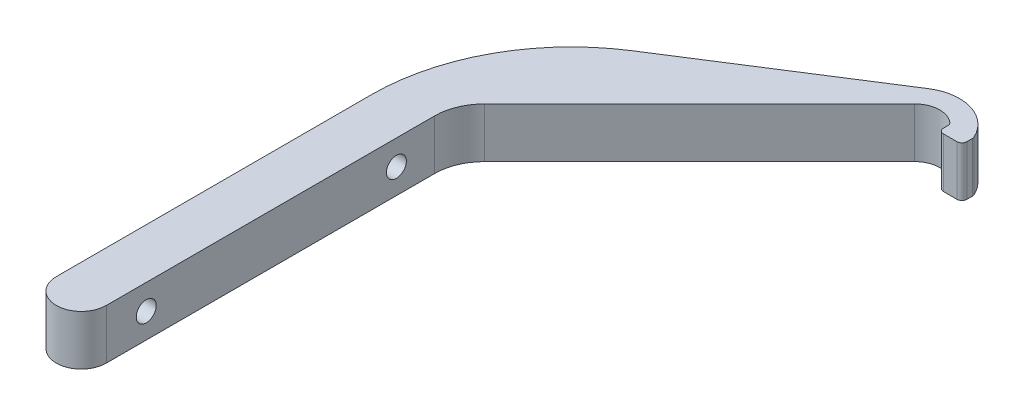
ISO-10303-21;
HEADER;
FILE_DESCRIPTION(('STEP AP214'),'2;1');
FILE_NAME('part.step','',(''),(''),'','','');
FILE_SCHEMA(('AUTOMOTIVE_DESIGN { 1 0 10303 214 1 1 1 1 }'));
ENDSEC;
DATA;
#1=APPLICATION_CONTEXT('core data for automotive mechanical design processes');
#2=APPLICATION_PROTOCOL_DEFINITION('international standard','automotive_design',2000,#1);
#3=PRODUCT_CONTEXT('',#1,'mechanical');
#4=PRODUCT('Part','Part','',(#3));
#5=PRODUCT_RELATED_PRODUCT_CATEGORY('part','',(#4));
#6=PRODUCT_DEFINITION_FORMATION('','',#4);
#7=PRODUCT_DEFINITION_CONTEXT('part definition',#1,'design');
#8=PRODUCT_DEFINITION('design','',#6,#7);
#9=PRODUCT_DEFINITION_SHAPE('','',#8);
#10=(LENGTH_UNIT() NAMED_UNIT(*) SI_UNIT(.MILLI.,.METRE.));
#11=(NAMED_UNIT(*) PLANE_ANGLE_UNIT() SI_UNIT($,.RADIAN.));
#12=(NAMED_UNIT(*) SI_UNIT($,.STERADIAN.) SOLID_ANGLE_UNIT());
#13=UNCERTAINTY_MEASURE_WITH_UNIT(LENGTH_MEASURE(1.E-05),#10,'distance_accuracy_value','');
#14=(GEOMETRIC_REPRESENTATION_CONTEXT(3) GLOBAL_UNCERTAINTY_ASSIGNED_CONTEXT((#13)) GLOBAL_UNIT_ASSIGNED_CONTEXT((#10,
#11,#12)) REPRESENTATION_CONTEXT('',''));
#15=CARTESIAN_POINT('',(0.,0.,0.));
#16=DIRECTION('',(0.,0.,1.));
#17=DIRECTION('',(1.,0.,0.));
#18=AXIS2_PLACEMENT_3D('',#15,#16,#17);
#19=CARTESIAN_POINT('',(5.,10.,10.));
#20=DIRECTION('',(0.,-1.,0.));
#21=DIRECTION('',(0.,0.,-1.));
#22=AXIS2_PLACEMENT_3D('',#19,#20,#21);
#23=CYLINDRICAL_SURFACE('',#22,5.);
#24=CARTESIAN_POINT('',(5.,0.,10.));
#25=DIRECTION('',(0.,1.,0.));
#26=DIRECTION('',(0.,0.,-1.));
#27=AXIS2_PLACEMENT_3D('',#24,#25,#26);
#28=CIRCLE('',#27,5.);
#29=CARTESIAN_POINT('',(0.,0.,10.));
#30=VERTEX_POINT('',#29);
#31=CARTESIAN_POINT('',(10.,0.,9.99999999999996));
#32=VERTEX_POINT('',#31);
#33=EDGE_CURVE('E184',#30,#32,#28,.T.);
#34=ORIENTED_EDGE('',*,*,#33,.T.);
#35=DIRECTION('',(0.,-1.,0.));
#36=VECTOR('',#35,1.);
#37=CARTESIAN_POINT('',(10.,10.,9.99999999999996));
#38=LINE('',#37,#36);
#39=CARTESIAN_POINT('',(10.,10.,9.99999999999996));
#40=VERTEX_POINT('',#39);
#41=EDGE_CURVE('E44',#40,#32,#38,.T.);
#42=ORIENTED_EDGE('',*,*,#41,.F.);
#43=CARTESIAN_POINT('',(5.,10.,10.));
#44=DIRECTION('',(0.,1.,0.));
#45=DIRECTION('',(0.,0.,-1.));
#46=AXIS2_PLACEMENT_3D('',#43,#44,#45);
#47=CIRCLE('',#46,5.);
#48=CARTESIAN_POINT('',(0.,10.,10.));
#49=VERTEX_POINT('',#48);
#50=EDGE_CURVE('E120',#49,#40,#47,.T.);
#51=ORIENTED_EDGE('',*,*,#50,.F.);
#52=DIRECTION('',(0.,-1.,0.));
#53=VECTOR('',#52,1.);
#54=CARTESIAN_POINT('',(0.,10.,10.));
#55=LINE('',#54,#53);
#56=EDGE_CURVE('E11',#49,#30,#55,.T.);
#57=ORIENTED_EDGE('',*,*,#56,.T.);
#58=EDGE_LOOP('',(#34,#42,#51,#57));
#59=FACE_BOUND('',#58,.T.);
#60=ADVANCED_FACE('F36',(#59),#23,.T.);
#61=CARTESIAN_POINT('',(10.,10.,0.137982079383578));
#62=DIRECTION('',(-1.,0.,0.));
#63=DIRECTION('',(0.,0.,1.));
#64=AXIS2_PLACEMENT_3D('',#61,#62,#63);
#65=PLANE('',#64);
#66=CARTESIAN_POINT('',(10.,5.,-48.0552485349334));
#67=DIRECTION('',(-1.,0.,0.));
#68=DIRECTION('',(0.,0.,1.));
#69=AXIS2_PLACEMENT_3D('',#66,#67,#68);
#70=CIRCLE('',#69,2.);
#71=CARTESIAN_POINT('',(10.,5.,-46.0552485349334));
#72=VERTEX_POINT('',#71);
#73=EDGE_CURVE('E188',#72,#72,#70,.T.);
#74=ORIENTED_EDGE('',*,*,#73,.T.);
#75=EDGE_LOOP('',(#74));
#76=FACE_BOUND('',#75,.T.);
#77=CARTESIAN_POINT('',(10.,5.,2.));
#78=DIRECTION('',(-1.,0.,0.));
#79=DIRECTION('',(0.,0.,1.));
#80=AXIS2_PLACEMENT_3D('',#77,#78,#79);
#81=CIRCLE('',#80,2.);
#82=CARTESIAN_POINT('',(10.,5.,4.));
#83=VERTEX_POINT('',#82);
#84=EDGE_CURVE('E346',#83,#83,#81,.T.);
#85=ORIENTED_EDGE('',*,*,#84,.T.);
#86=EDGE_LOOP('',(#85));
#87=FACE_BOUND('',#86,.T.);
#88=DIRECTION('',(0.,0.,-1.));
#89=VECTOR('',#88,1.);
#90=CARTESIAN_POINT('',(10.,0.,0.137982079383578));
#91=LINE('',#90,#89);
#92=CARTESIAN_POINT('',(10.,0.,-55.7198822968855));
#93=VERTEX_POINT('',#92);
#94=EDGE_CURVE('E187',#32,#93,#91,.T.);
#95=ORIENTED_EDGE('',*,*,#94,.T.);
#96=DIRECTION('',(0.,-1.,0.));
#97=VECTOR('',#96,1.);
#98=CARTESIAN_POINT('',(10.,10.,-55.7198822968855));
#99=LINE('',#98,#97);
#100=CARTESIAN_POINT('',(10.,10.,-55.7198822968855));
#101=VERTEX_POINT('',#100);
#102=EDGE_CURVE('E245',#101,#93,#99,.T.);
#103=ORIENTED_EDGE('',*,*,#102,.F.);
#104=DIRECTION('',(0.,0.,-1.));
#105=VECTOR('',#104,1.);
#106=CARTESIAN_POINT('',(10.,10.,0.137982079383578));
#107=LINE('',#106,#105);
#108=EDGE_CURVE('E252',#40,#101,#107,.T.);
#109=ORIENTED_EDGE('',*,*,#108,.F.);
#110=ORIENTED_EDGE('',*,*,#41,.T.);
#111=EDGE_LOOP('',(#95,#103,#109,#110));
#112=FACE_BOUND('',#111,.T.);
#113=ADVANCED_FACE('F250',(#76,#87,#112),#65,.F.);
#114=CARTESIAN_POINT('',(20.,10.,-55.7198822968855));
#115=DIRECTION('',(0.,-1.,0.));
#116=DIRECTION('',(0.,0.,-1.));
#117=AXIS2_PLACEMENT_3D('',#114,#115,#116);
#118=CYLINDRICAL_SURFACE('',#117,9.99999999999997);
#119=CARTESIAN_POINT('',(20.,0.,-55.7198822968855));
#120=DIRECTION('',(0.,-1.,0.));
#121=DIRECTION('',(0.,0.,-1.));
#122=AXIS2_PLACEMENT_3D('',#119,#120,#121);
#123=CIRCLE('',#122,9.99999999999997);
#124=CARTESIAN_POINT('',(12.9289321881345,0.,-62.7909501087509));
#125=VERTEX_POINT('',#124);
#126=EDGE_CURVE('E190',#93,#125,#123,.T.);
#127=ORIENTED_EDGE('',*,*,#126,.T.);
#128=DIRECTION('',(0.,-1.,0.));
#129=VECTOR('',#128,1.);
#130=CARTESIAN_POINT('',(12.9289321881345,10.,-62.7909501087509));
#131=LINE('',#130,#129);
#132=CARTESIAN_POINT('',(12.9289321881345,10.,-62.7909501087509));
#133=VERTEX_POINT('',#132);
#134=EDGE_CURVE('E242',#133,#125,#131,.T.);
#135=ORIENTED_EDGE('',*,*,#134,.F.);
#136=CARTESIAN_POINT('',(20.,10.,-55.7198822968855));
#137=DIRECTION('',(0.,-1.,0.));
#138=DIRECTION('',(0.,0.,-1.));
#139=AXIS2_PLACEMENT_3D('',#136,#137,#138);
#140=CIRCLE('',#139,9.99999999999997);
#141=EDGE_CURVE('E271',#101,#133,#140,.T.);
#142=ORIENTED_EDGE('',*,*,#141,.F.);
#143=ORIENTED_EDGE('',*,*,#102,.T.);
#144=EDGE_LOOP('',(#127,#135,#142,#143));
#145=FACE_BOUND('',#144,.T.);
#146=ADVANCED_FACE('F262',(#145),#118,.F.);
#147=CARTESIAN_POINT('',(12.9289321881345,10.,-62.7909501087509));
#148=DIRECTION('',(-0.707106781186547,0.,-0.707106781186548));
#149=DIRECTION('',(-0.707106781186548,0.,0.707106781186547));
#150=AXIS2_PLACEMENT_3D('',#147,#148,#149);
#151=PLANE('',#150);
#152=DIRECTION('',(0.707106781186548,0.,-0.707106781186547));
#153=VECTOR('',#152,1.);
#154=CARTESIAN_POINT('',(12.9289321881345,0.,-62.7909501087509));
#155=LINE('',#154,#153);
#156=CARTESIAN_POINT('',(55.9619407771257,0.,-105.823958697742));
#157=VERTEX_POINT('',#156);
#158=EDGE_CURVE('E192',#125,#157,#155,.T.);
#159=ORIENTED_EDGE('',*,*,#158,.T.);
#160=DIRECTION('',(0.,-1.,0.));
#161=VECTOR('',#160,1.);
#162=CARTESIAN_POINT('',(55.9619407771257,10.,-105.823958697742));
#163=LINE('',#162,#161);
#164=CARTESIAN_POINT('',(55.9619407771257,10.,-105.823958697742));
#165=VERTEX_POINT('',#164);
#166=EDGE_CURVE('E239',#165,#157,#163,.T.);
#167=ORIENTED_EDGE('',*,*,#166,.F.);
#168=DIRECTION('',(0.707106781186548,0.,-0.707106781186547));
#169=VECTOR('',#168,1.);
#170=CARTESIAN_POINT('',(12.9289321881345,10.,-62.7909501087509));
#171=LINE('',#170,#169);
#172=EDGE_CURVE('E268',#133,#165,#171,.T.);
#173=ORIENTED_EDGE('',*,*,#172,.F.);
#174=ORIENTED_EDGE('',*,*,#134,.T.);
#175=EDGE_LOOP('',(#159,#167,#173,#174));
#176=FACE_BOUND('',#175,.T.);
#177=ADVANCED_FACE('F266',(#176),#151,.F.);
#178=CARTESIAN_POINT('',(59.4974746830584,10.,-102.288424791809));
#179=DIRECTION('',(0.,-1.,0.));
#180=DIRECTION('',(0.,0.,-1.));
#181=AXIS2_PLACEMENT_3D('',#178,#179,#180);
#182=CYLINDRICAL_SURFACE('',#181,5.);
#183=CARTESIAN_POINT('',(59.4974746830584,0.,-102.288424791809));
#184=DIRECTION('',(0.,-1.,0.));
#185=DIRECTION('',(0.,0.,-1.));
#186=AXIS2_PLACEMENT_3D('',#183,#184,#185);
#187=CIRCLE('',#186,5.);
#188=CARTESIAN_POINT('',(62.6668920654743,0.,-106.155567594453));
#189=VERTEX_POINT('',#188);
#190=EDGE_CURVE('E194',#157,#189,#187,.T.);
#191=ORIENTED_EDGE('',*,*,#190,.T.);
#192=DIRECTION('',(0.,-1.,0.));
#193=VECTOR('',#192,1.);
#194=CARTESIAN_POINT('',(62.6668920654743,10.,-106.155567594453));
#195=LINE('',#194,#193);
#196=CARTESIAN_POINT('',(62.6668920654743,10.,-106.155567594453));
#197=VERTEX_POINT('',#196);
#198=EDGE_CURVE('E236',#197,#189,#195,.T.);
#199=ORIENTED_EDGE('',*,*,#198,.F.);
#200=CARTESIAN_POINT('',(59.4974746830584,10.,-102.288424791809));
#201=DIRECTION('',(0.,-1.,0.));
#202=DIRECTION('',(0.,0.,-1.));
#203=AXIS2_PLACEMENT_3D('',#200,#201,#202);
#204=CIRCLE('',#203,5.);
#205=EDGE_CURVE('E270',#165,#197,#204,.T.);
#206=ORIENTED_EDGE('',*,*,#205,.F.);
#207=ORIENTED_EDGE('',*,*,#166,.T.);
#208=EDGE_LOOP('',(#191,#199,#206,#207));
#209=FACE_BOUND('',#208,.T.);
#210=ADVANCED_FACE('F323',(#209),#182,.F.);
#211=CARTESIAN_POINT('',(62.0330085889911,10.,-105.382139033924));
#212=DIRECTION('',(0.,-1.,0.));
#213=DIRECTION('',(0.,0.,-1.));
#214=AXIS2_PLACEMENT_3D('',#211,#212,#213);
#215=CYLINDRICAL_SURFACE('',#214,0.999999999999995);
#216=CARTESIAN_POINT('',(62.0330085889911,0.,-105.382139033924));
#217=DIRECTION('',(0.,-1.,0.));
#218=DIRECTION('',(0.,0.,-1.));
#219=AXIS2_PLACEMENT_3D('',#216,#217,#218);
#220=CIRCLE('',#219,0.999999999999995);
#221=CARTESIAN_POINT('',(63.0330085889911,0.,-105.382139033924));
#222=VERTEX_POINT('',#221);
#223=EDGE_CURVE('E196',#189,#222,#220,.T.);
#224=ORIENTED_EDGE('',*,*,#223,.T.);
#225=DIRECTION('',(0.,-1.,0.));
#226=VECTOR('',#225,1.);
#227=CARTESIAN_POINT('',(63.0330085889911,10.,-105.382139033924));
#228=LINE('',#227,#226);
#229=CARTESIAN_POINT('',(63.0330085889911,10.,-105.382139033924));
#230=VERTEX_POINT('',#229);
#231=EDGE_CURVE('E233',#230,#222,#228,.T.);
#232=ORIENTED_EDGE('',*,*,#231,.F.);
#233=CARTESIAN_POINT('',(62.0330085889911,10.,-105.382139033924));
#234=DIRECTION('',(0.,-1.,0.));
#235=DIRECTION('',(0.,0.,-1.));
#236=AXIS2_PLACEMENT_3D('',#233,#234,#235);
#237=CIRCLE('',#236,0.999999999999995);
#238=EDGE_CURVE('E273',#197,#230,#237,.T.);
#239=ORIENTED_EDGE('',*,*,#238,.F.);
#240=ORIENTED_EDGE('',*,*,#198,.T.);
#241=EDGE_LOOP('',(#224,#232,#239,#240));
#242=FACE_BOUND('',#241,.T.);
#243=ADVANCED_FACE('F320',(#242),#215,.F.);
#244=CARTESIAN_POINT('',(63.0330085889911,10.,-105.382139033924));
#245=DIRECTION('',(1.,0.,0.));
#246=DIRECTION('',(0.,0.,-1.));
#247=AXIS2_PLACEMENT_3D('',#244,#245,#246);
#248=PLANE('',#247);
#249=DIRECTION('',(0.,0.,1.));
#250=VECTOR('',#249,1.);
#251=CARTESIAN_POINT('',(63.0330085889911,0.,-105.382139033924));
#252=LINE('',#251,#250);
#253=CARTESIAN_POINT('',(63.0330085889911,0.,-104.504374958384));
#254=VERTEX_POINT('',#253);
#255=EDGE_CURVE('E198',#222,#254,#252,.T.);
#256=ORIENTED_EDGE('',*,*,#255,.T.);
#257=DIRECTION('',(0.,-1.,0.));
#258=VECTOR('',#257,1.);
#259=CARTESIAN_POINT('',(63.0330085889911,10.,-104.504374958384));
#260=LINE('',#259,#258);
#261=CARTESIAN_POINT('',(63.0330085889911,10.,-104.504374958384));
#262=VERTEX_POINT('',#261);
#263=EDGE_CURVE('E230',#262,#254,#260,.T.);
#264=ORIENTED_EDGE('',*,*,#263,.F.);
#265=DIRECTION('',(0.,0.,1.));
#266=VECTOR('',#265,1.);
#267=CARTESIAN_POINT('',(63.0330085889911,10.,-105.382139033924));
#268=LINE('',#267,#266);
#269=EDGE_CURVE('E279',#230,#262,#268,.T.);
#270=ORIENTED_EDGE('',*,*,#269,.F.);
#271=ORIENTED_EDGE('',*,*,#231,.T.);
#272=EDGE_LOOP('',(#256,#264,#270,#271));
#273=FACE_BOUND('',#272,.T.);
#274=ADVANCED_FACE('F315',(#273),#248,.F.);
#275=CARTESIAN_POINT('',(64.0330085889911,10.,-104.504374958384));
#276=DIRECTION('',(0.,-1.,0.));
#277=DIRECTION('',(0.,0.,-1.));
#278=AXIS2_PLACEMENT_3D('',#275,#276,#277);
#279=CYLINDRICAL_SURFACE('',#278,1.);
#280=CARTESIAN_POINT('',(64.0330085889911,0.,-104.504374958384));
#281=DIRECTION('',(0.,1.,0.));
#282=DIRECTION('',(0.,0.,1.));
#283=AXIS2_PLACEMENT_3D('',#280,#281,#282);
#284=CIRCLE('',#283,1.);
#285=CARTESIAN_POINT('',(64.0330085889911,0.,-103.504374958384));
#286=VERTEX_POINT('',#285);
#287=EDGE_CURVE('E200',#254,#286,#284,.T.);
#288=ORIENTED_EDGE('',*,*,#287,.T.);
#289=DIRECTION('',(0.,-1.,0.));
#290=VECTOR('',#289,1.);
#291=CARTESIAN_POINT('',(64.0330085889911,10.,-103.504374958384));
#292=LINE('',#291,#290);
#293=CARTESIAN_POINT('',(64.0330085889911,10.,-103.504374958384));
#294=VERTEX_POINT('',#293);
#295=EDGE_CURVE('E227',#294,#286,#292,.T.);
#296=ORIENTED_EDGE('',*,*,#295,.F.);
#297=CARTESIAN_POINT('',(64.0330085889911,10.,-104.504374958384));
#298=DIRECTION('',(0.,1.,0.));
#299=DIRECTION('',(0.,0.,1.));
#300=AXIS2_PLACEMENT_3D('',#297,#298,#299);
#301=CIRCLE('',#300,1.);
#302=EDGE_CURVE('E281',#262,#294,#301,.T.);
#303=ORIENTED_EDGE('',*,*,#302,.F.);
#304=ORIENTED_EDGE('',*,*,#263,.T.);
#305=EDGE_LOOP('',(#288,#296,#303,#304));
#306=FACE_BOUND('',#305,.T.);
#307=ADVANCED_FACE('F310',(#306),#279,.T.);
#308=CARTESIAN_POINT('',(64.0330085889911,10.,-103.504374958384));
#309=DIRECTION('',(0.,0.,-1.));
#310=DIRECTION('',(-1.,0.,0.));
#311=AXIS2_PLACEMENT_3D('',#308,#309,#310);
#312=PLANE('',#311);
#313=DIRECTION('',(1.,0.,0.));
#314=VECTOR('',#313,1.);
#315=CARTESIAN_POINT('',(64.0330085889911,0.,-103.504374958384));
#316=LINE('',#315,#314);
#317=CARTESIAN_POINT('',(66.7229728332221,0.,-103.504374958384));
#318=VERTEX_POINT('',#317);
#319=EDGE_CURVE('E202',#286,#318,#316,.T.);
#320=ORIENTED_EDGE('',*,*,#319,.T.);
#321=DIRECTION('',(0.,-1.,0.));
#322=VECTOR('',#321,1.);
#323=CARTESIAN_POINT('',(66.7229728332221,10.,-103.504374958384));
#324=LINE('',#323,#322);
#325=CARTESIAN_POINT('',(66.7229728332221,10.,-103.504374958384));
#326=VERTEX_POINT('',#325);
#327=EDGE_CURVE('E224',#326,#318,#324,.T.);
#328=ORIENTED_EDGE('',*,*,#327,.F.);
#329=DIRECTION('',(1.,0.,0.));
#330=VECTOR('',#329,1.);
#331=CARTESIAN_POINT('',(64.0330085889911,10.,-103.504374958384));
#332=LINE('',#331,#330);
#333=EDGE_CURVE('E283',#294,#326,#332,.T.);
#334=ORIENTED_EDGE('',*,*,#333,.F.);
#335=ORIENTED_EDGE('',*,*,#295,.T.);
#336=EDGE_LOOP('',(#320,#328,#334,#335));
#337=FACE_BOUND('',#336,.T.);
#338=ADVANCED_FACE('F306',(#337),#312,.F.);
#339=CARTESIAN_POINT('',(66.7229728332221,10.,-104.504374958384));
#340=DIRECTION('',(0.,-1.,0.));
#341=DIRECTION('',(0.,0.,-1.));
#342=AXIS2_PLACEMENT_3D('',#339,#340,#341);
#343=CYLINDRICAL_SURFACE('',#342,1.);
#344=CARTESIAN_POINT('',(66.7229728332221,0.,-104.504374958384));
#345=DIRECTION('',(0.,1.,0.));
#346=DIRECTION('',(0.,0.,1.));
#347=AXIS2_PLACEMENT_3D('',#344,#345,#346);
#348=CIRCLE('',#347,1.);
#349=CARTESIAN_POINT('',(67.7229728332221,0.,-104.504374958384));
#350=VERTEX_POINT('',#349);
#351=EDGE_CURVE('E204',#318,#350,#348,.T.);
#352=ORIENTED_EDGE('',*,*,#351,.T.);
#353=DIRECTION('',(0.,-1.,0.));
#354=VECTOR('',#353,1.);
#355=CARTESIAN_POINT('',(67.7229728332221,10.,-104.504374958384));
#356=LINE('',#355,#354);
#357=CARTESIAN_POINT('',(67.7229728332221,10.,-104.504374958384));
#358=VERTEX_POINT('',#357);
#359=EDGE_CURVE('E221',#358,#350,#356,.T.);
#360=ORIENTED_EDGE('',*,*,#359,.F.);
#361=CARTESIAN_POINT('',(66.7229728332221,10.,-104.504374958384));
#362=DIRECTION('',(0.,1.,0.));
#363=DIRECTION('',(0.,0.,1.));
#364=AXIS2_PLACEMENT_3D('',#361,#362,#363);
#365=CIRCLE('',#364,1.);
#366=EDGE_CURVE('E285',#326,#358,#365,.T.);
#367=ORIENTED_EDGE('',*,*,#366,.F.);
#368=ORIENTED_EDGE('',*,*,#327,.T.);
#369=EDGE_LOOP('',(#352,#360,#367,#368));
#370=FACE_BOUND('',#369,.T.);
#371=ADVANCED_FACE('F302',(#370),#343,.T.);
#372=CARTESIAN_POINT('',(67.7229728332221,10.,-104.504374958384));
#373=DIRECTION('',(-1.,0.,0.));
#374=DIRECTION('',(0.,0.,1.));
#375=AXIS2_PLACEMENT_3D('',#372,#373,#374);
#376=PLANE('',#375);
#377=DIRECTION('',(0.,0.,-1.));
#378=VECTOR('',#377,1.);
#379=CARTESIAN_POINT('',(67.7229728332221,0.,-104.504374958384));
#380=LINE('',#379,#378);
#381=CARTESIAN_POINT('',(67.7229728332221,0.,-105.611782234051));
#382=VERTEX_POINT('',#381);
#383=EDGE_CURVE('E206',#350,#382,#380,.T.);
#384=ORIENTED_EDGE('',*,*,#383,.T.);
#385=DIRECTION('',(0.,-1.,0.));
#386=VECTOR('',#385,1.);
#387=CARTESIAN_POINT('',(67.7229728332221,10.,-105.611782234051));
#388=LINE('',#387,#386);
#389=CARTESIAN_POINT('',(67.7229728332221,10.,-105.611782234051));
#390=VERTEX_POINT('',#389);
#391=EDGE_CURVE('E218',#390,#382,#388,.T.);
#392=ORIENTED_EDGE('',*,*,#391,.F.);
#393=DIRECTION('',(0.,0.,-1.));
#394=VECTOR('',#393,1.);
#395=CARTESIAN_POINT('',(67.7229728332221,10.,-104.504374958384));
#396=LINE('',#395,#394);
#397=EDGE_CURVE('E287',#358,#390,#396,.T.);
#398=ORIENTED_EDGE('',*,*,#397,.F.);
#399=ORIENTED_EDGE('',*,*,#359,.T.);
#400=EDGE_LOOP('',(#384,#392,#398,#399));
#401=FACE_BOUND('',#400,.T.);
#402=ADVANCED_FACE('F293',(#401),#376,.F.);
#403=CARTESIAN_POINT('',(66.7229728332221,10.,-105.611782234051));
#404=DIRECTION('',(0.,-1.,0.));
#405=DIRECTION('',(0.,0.,-1.));
#406=AXIS2_PLACEMENT_3D('',#403,#404,#405);
#407=CYLINDRICAL_SURFACE('',#406,1.00000000000001);
#408=CARTESIAN_POINT('',(66.7229728332221,0.,-105.611782234051));
#409=DIRECTION('',(0.,1.,0.));
#410=DIRECTION('',(0.,0.,-1.));
#411=AXIS2_PLACEMENT_3D('',#408,#409,#410);
#412=CIRCLE('',#411,1.00000000000001);
#413=CARTESIAN_POINT('',(67.6314810294348,0.,-106.029649267226));
#414=VERTEX_POINT('',#413);
#415=EDGE_CURVE('E208',#382,#414,#412,.T.);
#416=ORIENTED_EDGE('',*,*,#415,.T.);
#417=DIRECTION('',(0.,-1.,0.));
#418=VECTOR('',#417,1.);
#419=CARTESIAN_POINT('',(67.6314810294348,10.,-106.029649267226));
#420=LINE('',#419,#418);
#421=CARTESIAN_POINT('',(67.6314810294348,10.,-106.029649267226));
#422=VERTEX_POINT('',#421);
#423=EDGE_CURVE('E173',#422,#414,#420,.T.);
#424=ORIENTED_EDGE('',*,*,#423,.F.);
#425=CARTESIAN_POINT('',(66.7229728332221,10.,-105.611782234051));
#426=DIRECTION('',(0.,1.,0.));
#427=DIRECTION('',(0.,0.,-1.));
#428=AXIS2_PLACEMENT_3D('',#425,#426,#427);
#429=CIRCLE('',#428,1.00000000000001);
#430=EDGE_CURVE('E164',#390,#422,#429,.T.);
#431=ORIENTED_EDGE('',*,*,#430,.F.);
#432=ORIENTED_EDGE('',*,*,#391,.T.);
#433=EDGE_LOOP('',(#416,#424,#431,#432));
#434=FACE_BOUND('',#433,.T.);
#435=ADVANCED_FACE('F297',(#434),#407,.T.);
#436=CARTESIAN_POINT('',(59.4974746830584,10.,-102.288424791809));
#437=DIRECTION('',(0.,-1.,0.));
#438=DIRECTION('',(0.,0.,-1.));
#439=AXIS2_PLACEMENT_3D('',#436,#437,#438);
#440=CYLINDRICAL_SURFACE('',#439,8.95314580571252);
#441=CARTESIAN_POINT('',(59.4974746830584,0.,-102.288424791809));
#442=DIRECTION('',(0.,1.,0.));
#443=DIRECTION('',(0.,0.,-1.));
#444=AXIS2_PLACEMENT_3D('',#441,#442,#443);
#445=CIRCLE('',#444,8.95314580571252);
#446=CARTESIAN_POINT('',(54.686952948177,0.,-109.839431377463));
#447=VERTEX_POINT('',#446);
#448=EDGE_CURVE('E172',#414,#447,#445,.T.);
#449=ORIENTED_EDGE('',*,*,#448,.T.);
#450=DIRECTION('',(0.,-1.,0.));
#451=VECTOR('',#450,1.);
#452=CARTESIAN_POINT('',(54.686952948177,10.,-109.839431377463));
#453=LINE('',#452,#451);
#454=CARTESIAN_POINT('',(54.686952948177,10.,-109.839431377463));
#455=VERTEX_POINT('',#454);
#456=EDGE_CURVE('E169',#455,#447,#453,.T.);
#457=ORIENTED_EDGE('',*,*,#456,.F.);
#458=CARTESIAN_POINT('',(59.4974746830584,10.,-102.288424791809));
#459=DIRECTION('',(0.,1.,0.));
#460=DIRECTION('',(0.,0.,-1.));
#461=AXIS2_PLACEMENT_3D('',#458,#459,#460);
#462=CIRCLE('',#461,8.95314580571252);
#463=EDGE_CURVE('E158',#422,#455,#462,.T.);
#464=ORIENTED_EDGE('',*,*,#463,.F.);
#465=ORIENTED_EDGE('',*,*,#423,.T.);
#466=EDGE_LOOP('',(#449,#457,#464,#465));
#467=FACE_BOUND('',#466,.T.);
#468=ADVANCED_FACE('F170',(#467),#440,.T.);
#469=CARTESIAN_POINT('',(54.686952948177,10.,-109.839431377463));
#470=DIRECTION('',(0.537299608346828,0.,0.843391445812883));
#471=DIRECTION('',(0.843391445812883,0.,-0.537299608346828));
#472=AXIS2_PLACEMENT_3D('',#469,#470,#471);
#473=PLANE('',#472);
#474=DIRECTION('',(-0.843391445812883,0.,0.537299608346828));
#475=VECTOR('',#474,1.);
#476=CARTESIAN_POINT('',(54.686952948177,0.,-109.839431377463));
#477=LINE('',#476,#475);
#478=CARTESIAN_POINT('',(18.5080156661269,0.,-86.7909063674487));
#479=VERTEX_POINT('',#478);
#480=EDGE_CURVE('E106',#447,#479,#477,.T.);
#481=ORIENTED_EDGE('',*,*,#480,.T.);
#482=DIRECTION('',(0.,-1.,0.));
#483=VECTOR('',#482,1.);
#484=CARTESIAN_POINT('',(18.5080156661269,10.,-86.7909063674487));
#485=LINE('',#484,#483);
#486=CARTESIAN_POINT('',(18.5080156661269,10.,-86.7909063674487));
#487=VERTEX_POINT('',#486);
#488=EDGE_CURVE('E174',#487,#479,#485,.T.);
#489=ORIENTED_EDGE('',*,*,#488,.F.);
#490=DIRECTION('',(-0.843391445812883,0.,0.537299608346828));
#491=VECTOR('',#490,1.);
#492=CARTESIAN_POINT('',(54.686952948177,10.,-109.839431377463));
#493=LINE('',#492,#491);
#494=EDGE_CURVE('E162',#455,#487,#493,.T.);
#495=ORIENTED_EDGE('',*,*,#494,.F.);
#496=ORIENTED_EDGE('',*,*,#456,.T.);
#497=EDGE_LOOP('',(#481,#489,#495,#496));
#498=FACE_BOUND('',#497,.T.);
#499=ADVANCED_FACE('F176',(#498),#473,.F.);
#500=CARTESIAN_POINT('',(40.,10.,-53.0552485349334));
#501=DIRECTION('',(0.,-1.,0.));
#502=DIRECTION('',(0.,0.,-1.));
#503=AXIS2_PLACEMENT_3D('',#500,#501,#502);
#504=CYLINDRICAL_SURFACE('',#503,40.);
#505=CARTESIAN_POINT('',(40.,0.,-53.0552485349334));
#506=DIRECTION('',(0.,1.,0.));
#507=DIRECTION('',(0.,0.,-1.));
#508=AXIS2_PLACEMENT_3D('',#505,#506,#507);
#509=CIRCLE('',#508,40.);
#510=CARTESIAN_POINT('',(0.,0.,-53.0552485349334));
#511=VERTEX_POINT('',#510);
#512=EDGE_CURVE('E113',#479,#511,#509,.T.);
#513=ORIENTED_EDGE('',*,*,#512,.T.);
#514=DIRECTION('',(0.,-1.,0.));
#515=VECTOR('',#514,1.);
#516=CARTESIAN_POINT('',(0.,10.,-53.0552485349334));
#517=LINE('',#516,#515);
#518=CARTESIAN_POINT('',(0.,10.,-53.0552485349334));
#519=VERTEX_POINT('',#518);
#520=EDGE_CURVE('E180',#519,#511,#517,.T.);
#521=ORIENTED_EDGE('',*,*,#520,.F.);
#522=CARTESIAN_POINT('',(40.,10.,-53.0552485349334));
#523=DIRECTION('',(0.,1.,0.));
#524=DIRECTION('',(0.,0.,-1.));
#525=AXIS2_PLACEMENT_3D('',#522,#523,#524);
#526=CIRCLE('',#525,40.);
#527=EDGE_CURVE('E178',#487,#519,#526,.T.);
#528=ORIENTED_EDGE('',*,*,#527,.F.);
#529=ORIENTED_EDGE('',*,*,#488,.T.);
#530=EDGE_LOOP('',(#513,#521,#528,#529));
#531=FACE_BOUND('',#530,.T.);
#532=ADVANCED_FACE('F359',(#531),#504,.T.);
#533=CARTESIAN_POINT('',(0.,10.,0.));
#534=DIRECTION('',(1.,0.,0.));
#535=DIRECTION('',(0.,0.,-1.));
#536=AXIS2_PLACEMENT_3D('',#533,#534,#535);
#537=PLANE('',#536);
#538=CARTESIAN_POINT('',(0.,5.,-48.0552485349334));
#539=DIRECTION('',(-1.,0.,0.));
#540=DIRECTION('',(0.,0.,1.));
#541=AXIS2_PLACEMENT_3D('',#538,#539,#540);
#542=CIRCLE('',#541,2.);
#543=CARTESIAN_POINT('',(0.,5.,-46.0552485349334));
#544=VERTEX_POINT('',#543);
#545=EDGE_CURVE('E348',#544,#544,#542,.T.);
#546=ORIENTED_EDGE('',*,*,#545,.F.);
#547=EDGE_LOOP('',(#546));
#548=FACE_BOUND('',#547,.T.);
#549=CARTESIAN_POINT('',(0.,5.,2.));
#550=DIRECTION('',(-1.,0.,0.));
#551=DIRECTION('',(0.,0.,1.));
#552=AXIS2_PLACEMENT_3D('',#549,#550,#551);
#553=CIRCLE('',#552,2.);
#554=CARTESIAN_POINT('',(0.,5.,4.));
#555=VERTEX_POINT('',#554);
#556=EDGE_CURVE('E349',#555,#555,#553,.T.);
#557=ORIENTED_EDGE('',*,*,#556,.F.);
#558=EDGE_LOOP('',(#557));
#559=FACE_BOUND('',#558,.T.);
#560=DIRECTION('',(0.,0.,1.));
#561=VECTOR('',#560,1.);
#562=CARTESIAN_POINT('',(0.,0.,0.));
#563=LINE('',#562,#561);
#564=EDGE_CURVE('E213',#511,#30,#563,.T.);
#565=ORIENTED_EDGE('',*,*,#564,.T.);
#566=ORIENTED_EDGE('',*,*,#56,.F.);
#567=DIRECTION('',(0.,0.,1.));
#568=VECTOR('',#567,1.);
#569=CARTESIAN_POINT('',(0.,10.,0.));
#570=LINE('',#569,#568);
#571=EDGE_CURVE('E52',#519,#49,#570,.T.);
#572=ORIENTED_EDGE('',*,*,#571,.F.);
#573=ORIENTED_EDGE('',*,*,#520,.T.);
#574=EDGE_LOOP('',(#565,#566,#572,#573));
#575=FACE_BOUND('',#574,.T.);
#576=ADVANCED_FACE('F358',(#548,#559,#575),#537,.F.);
#577=CARTESIAN_POINT('',(5.,10.,10.));
#578=DIRECTION('',(0.,-1.,0.));
#579=DIRECTION('',(0.,0.,-1.));
#580=AXIS2_PLACEMENT_3D('',#577,#578,#579);
#581=PLANE('',#580);
#582=ORIENTED_EDGE('',*,*,#571,.T.);
#583=ORIENTED_EDGE('',*,*,#50,.T.);
#584=ORIENTED_EDGE('',*,*,#108,.T.);
#585=ORIENTED_EDGE('',*,*,#141,.T.);
#586=ORIENTED_EDGE('',*,*,#172,.T.);
#587=ORIENTED_EDGE('',*,*,#205,.T.);
#588=ORIENTED_EDGE('',*,*,#238,.T.);
#589=ORIENTED_EDGE('',*,*,#269,.T.);
#590=ORIENTED_EDGE('',*,*,#302,.T.);
#591=ORIENTED_EDGE('',*,*,#333,.T.);
#592=ORIENTED_EDGE('',*,*,#366,.T.);
#593=ORIENTED_EDGE('',*,*,#397,.T.);
#594=ORIENTED_EDGE('',*,*,#430,.T.);
#595=ORIENTED_EDGE('',*,*,#463,.T.);
#596=ORIENTED_EDGE('',*,*,#494,.T.);
#597=ORIENTED_EDGE('',*,*,#527,.T.);
#598=EDGE_LOOP('',(#582,#583,#584,#585,#586,#587,#588,#589,#590,#591,#592,#593,#594,#595,#596,#597));
#599=FACE_BOUND('',#598,.T.);
#600=ADVANCED_FACE('F160',(#599),#581,.F.);
#601=CARTESIAN_POINT('',(5.,0.,10.));
#602=DIRECTION('',(0.,-1.,0.));
#603=DIRECTION('',(0.,0.,-1.));
#604=AXIS2_PLACEMENT_3D('',#601,#602,#603);
#605=PLANE('',#604);
#606=ORIENTED_EDGE('',*,*,#33,.F.);
#607=ORIENTED_EDGE('',*,*,#564,.F.);
#608=ORIENTED_EDGE('',*,*,#512,.F.);
#609=ORIENTED_EDGE('',*,*,#480,.F.);
#610=ORIENTED_EDGE('',*,*,#448,.F.);
#611=ORIENTED_EDGE('',*,*,#415,.F.);
#612=ORIENTED_EDGE('',*,*,#383,.F.);
#613=ORIENTED_EDGE('',*,*,#351,.F.);
#614=ORIENTED_EDGE('',*,*,#319,.F.);
#615=ORIENTED_EDGE('',*,*,#287,.F.);
#616=ORIENTED_EDGE('',*,*,#255,.F.);
#617=ORIENTED_EDGE('',*,*,#223,.F.);
#618=ORIENTED_EDGE('',*,*,#190,.F.);
#619=ORIENTED_EDGE('',*,*,#158,.F.);
#620=ORIENTED_EDGE('',*,*,#126,.F.);
#621=ORIENTED_EDGE('',*,*,#94,.F.);
#622=EDGE_LOOP('',(#606,#607,#608,#609,#610,#611,#612,#613,#614,#615,#616,#617,#618,#619,#620,#621));
#623=FACE_BOUND('',#622,.T.);
#624=ADVANCED_FACE('F256',(#623),#605,.T.);
#625=CARTESIAN_POINT('',(10.,5.,2.));
#626=DIRECTION('',(-1.,0.,0.));
#627=DIRECTION('',(0.,0.,1.));
#628=AXIS2_PLACEMENT_3D('',#625,#626,#627);
#629=CYLINDRICAL_SURFACE('',#628,2.);
#630=ORIENTED_EDGE('',*,*,#84,.F.);
#631=EDGE_LOOP('',(#630));
#632=FACE_BOUND('',#631,.T.);
#633=ORIENTED_EDGE('',*,*,#556,.T.);
#634=EDGE_LOOP('',(#633));
#635=FACE_BOUND('',#634,.T.);
#636=ADVANCED_FACE('F438',(#632,#635),#629,.F.);
#637=CARTESIAN_POINT('',(10.,5.,-48.0552485349334));
#638=DIRECTION('',(-1.,0.,0.));
#639=DIRECTION('',(0.,0.,1.));
#640=AXIS2_PLACEMENT_3D('',#637,#638,#639);
#641=CYLINDRICAL_SURFACE('',#640,2.);
#642=ORIENTED_EDGE('',*,*,#73,.F.);
#643=EDGE_LOOP('',(#642));
#644=FACE_BOUND('',#643,.T.);
#645=ORIENTED_EDGE('',*,*,#545,.T.);
#646=EDGE_LOOP('',(#645));
#647=FACE_BOUND('',#646,.T.);
#648=ADVANCED_FACE('F458',(#644,#647),#641,.F.);
#649=CLOSED_SHELL('',(#60,#113,#146,#177,#210,#243,#274,#307,#338,#371,#402,#435,#468,#499,#532,
#576,#600,#624,#636,#648));
#650=MANIFOLD_SOLID_BREP('B2',#649);
#651=ADVANCED_BREP_SHAPE_REPRESENTATION('',(#18,#650),#14);
#652=SHAPE_DEFINITION_REPRESENTATION(#9,#651);
ENDSEC;
END-ISO-10303-21;
